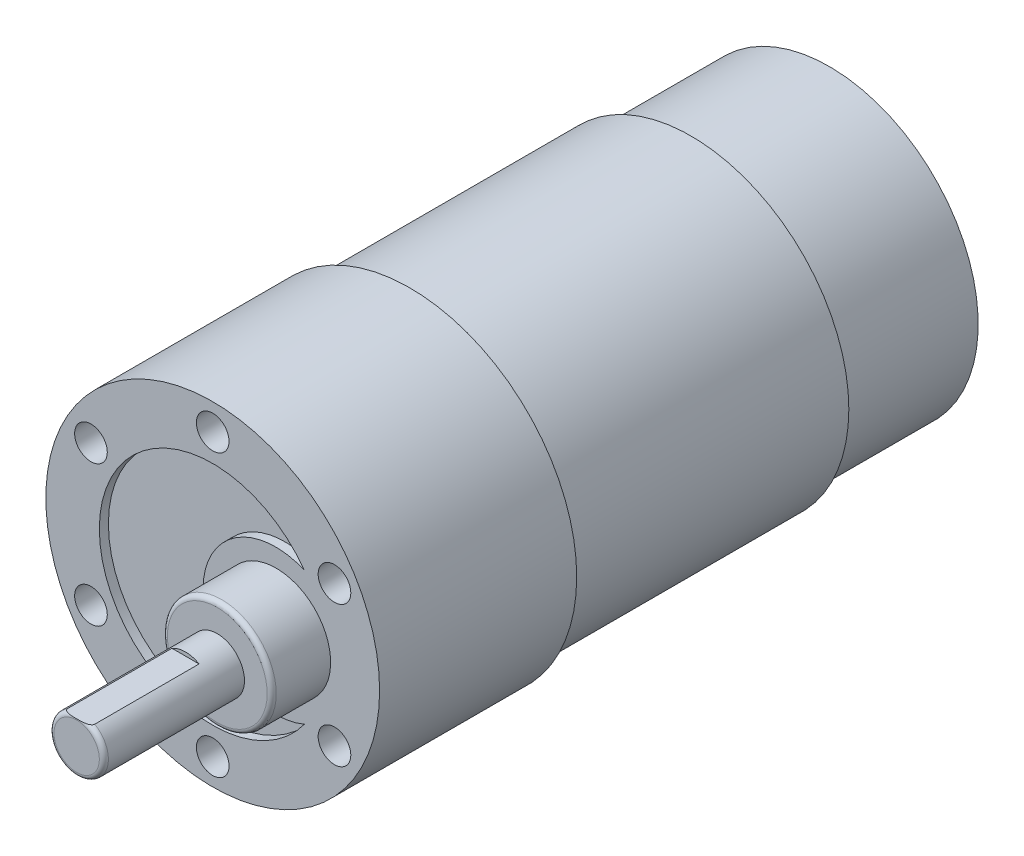
ISO-10303-21;
HEADER;
FILE_DESCRIPTION(('STEP AP214'),'2;1');
FILE_NAME('part.step','',(''),(''),'','','');
FILE_SCHEMA(('AUTOMOTIVE_DESIGN { 1 0 10303 214 1 1 1 1 }'));
ENDSEC;
DATA;
#1=APPLICATION_CONTEXT('core data for automotive mechanical design processes');
#2=APPLICATION_PROTOCOL_DEFINITION('international standard','automotive_design',2000,#1);
#3=PRODUCT_CONTEXT('',#1,'mechanical');
#4=PRODUCT('Part','Part','',(#3));
#5=PRODUCT_RELATED_PRODUCT_CATEGORY('part','',(#4));
#6=PRODUCT_DEFINITION_FORMATION('','',#4);
#7=PRODUCT_DEFINITION_CONTEXT('part definition',#1,'design');
#8=PRODUCT_DEFINITION('design','',#6,#7);
#9=PRODUCT_DEFINITION_SHAPE('','',#8);
#10=(LENGTH_UNIT() NAMED_UNIT(*) SI_UNIT(.MILLI.,.METRE.));
#11=(NAMED_UNIT(*) PLANE_ANGLE_UNIT() SI_UNIT($,.RADIAN.));
#12=(NAMED_UNIT(*) SI_UNIT($,.STERADIAN.) SOLID_ANGLE_UNIT());
#13=UNCERTAINTY_MEASURE_WITH_UNIT(LENGTH_MEASURE(1.E-05),#10,'distance_accuracy_value','');
#14=(GEOMETRIC_REPRESENTATION_CONTEXT(3) GLOBAL_UNCERTAINTY_ASSIGNED_CONTEXT((#13)) GLOBAL_UNIT_ASSIGNED_CONTEXT((#10,
#11,#12)) REPRESENTATION_CONTEXT('',''));
#15=CARTESIAN_POINT('',(0.,0.,0.));
#16=DIRECTION('',(0.,0.,1.));
#17=DIRECTION('',(1.,0.,0.));
#18=AXIS2_PLACEMENT_3D('',#15,#16,#17);
#19=CARTESIAN_POINT('',(0.,0.,-31.));
#20=DIRECTION('',(0.,0.,-1.));
#21=DIRECTION('',(-1.,0.,0.));
#22=AXIS2_PLACEMENT_3D('',#19,#20,#21);
#23=PLANE('',#22);
#24=CARTESIAN_POINT('',(0.,0.,-31.));
#25=DIRECTION('',(0.,0.,-1.));
#26=DIRECTION('',(-1.,0.,0.));
#27=AXIS2_PLACEMENT_3D('',#24,#25,#26);
#28=CIRCLE('',#27,16.4);
#29=CARTESIAN_POINT('',(-16.4,0.,-31.));
#30=VERTEX_POINT('',#29);
#31=EDGE_CURVE('E45',#30,#30,#28,.T.);
#32=ORIENTED_EDGE('',*,*,#31,.F.);
#33=EDGE_LOOP('',(#32));
#34=FACE_BOUND('',#33,.T.);
#35=CARTESIAN_POINT('',(0.,0.,-31.));
#36=DIRECTION('',(0.,0.,-1.));
#37=DIRECTION('',(-1.,0.,0.));
#38=AXIS2_PLACEMENT_3D('',#35,#36,#37);
#39=CIRCLE('',#38,17.4);
#40=CARTESIAN_POINT('',(-17.4,0.,-31.));
#41=VERTEX_POINT('',#40);
#42=EDGE_CURVE('E121',#41,#41,#39,.T.);
#43=ORIENTED_EDGE('',*,*,#42,.T.);
#44=EDGE_LOOP('',(#43));
#45=FACE_BOUND('',#44,.T.);
#46=ADVANCED_FACE('F37',(#34,#45),#23,.T.);
#47=CARTESIAN_POINT('',(0.,0.,21.73));
#48=DIRECTION('',(0.,0.,-1.));
#49=DIRECTION('',(-1.,0.,0.));
#50=AXIS2_PLACEMENT_3D('',#47,#48,#49);
#51=CYLINDRICAL_SURFACE('',#50,18.4);
#52=CARTESIAN_POINT('',(0.,0.,21.73));
#53=DIRECTION('',(0.,0.,1.));
#54=DIRECTION('',(1.,0.,0.));
#55=AXIS2_PLACEMENT_3D('',#52,#53,#54);
#56=CIRCLE('',#55,18.4);
#57=CARTESIAN_POINT('',(18.4,0.,21.73));
#58=VERTEX_POINT('',#57);
#59=EDGE_CURVE('E125',#58,#58,#56,.T.);
#60=ORIENTED_EDGE('',*,*,#59,.F.);
#61=EDGE_LOOP('',(#60));
#62=FACE_BOUND('',#61,.T.);
#63=CARTESIAN_POINT('',(0.,0.,0.));
#64=DIRECTION('',(0.,0.,1.));
#65=DIRECTION('',(1.,0.,0.));
#66=AXIS2_PLACEMENT_3D('',#63,#64,#65);
#67=CIRCLE('',#66,18.4);
#68=CARTESIAN_POINT('',(18.4,0.,0.));
#69=VERTEX_POINT('',#68);
#70=EDGE_CURVE('E124',#69,#69,#67,.T.);
#71=ORIENTED_EDGE('',*,*,#70,.T.);
#72=EDGE_LOOP('',(#71));
#73=FACE_BOUND('',#72,.T.);
#74=ADVANCED_FACE('F178',(#62,#73),#51,.T.);
#75=CARTESIAN_POINT('',(0.,0.,21.73));
#76=DIRECTION('',(0.,0.,1.));
#77=DIRECTION('',(1.,0.,0.));
#78=AXIS2_PLACEMENT_3D('',#75,#76,#77);
#79=PLANE('',#78);
#80=CARTESIAN_POINT('',(13.4233937586587,-7.75000000000016,21.73));
#81=DIRECTION('',(0.,0.,1.));
#82=DIRECTION('',(1.,0.,0.));
#83=AXIS2_PLACEMENT_3D('',#80,#81,#82);
#84=CIRCLE('',#83,1.8);
#85=CARTESIAN_POINT('',(15.2233937586587,-7.75000000000016,21.73));
#86=VERTEX_POINT('',#85);
#87=EDGE_CURVE('E453',#86,#86,#84,.T.);
#88=ORIENTED_EDGE('',*,*,#87,.F.);
#89=EDGE_LOOP('',(#88));
#90=FACE_BOUND('',#89,.T.);
#91=CARTESIAN_POINT('',(13.4233937586589,7.74999999999987,21.73));
#92=DIRECTION('',(0.,0.,1.));
#93=DIRECTION('',(1.,0.,0.));
#94=AXIS2_PLACEMENT_3D('',#91,#92,#93);
#95=CIRCLE('',#94,1.8);
#96=CARTESIAN_POINT('',(15.2233937586589,7.74999999999987,21.73));
#97=VERTEX_POINT('',#96);
#98=EDGE_CURVE('E452',#97,#97,#95,.T.);
#99=ORIENTED_EDGE('',*,*,#98,.F.);
#100=EDGE_LOOP('',(#99));
#101=FACE_BOUND('',#100,.T.);
#102=CARTESIAN_POINT('',(1.08235921504137E-13,15.5,21.73));
#103=DIRECTION('',(0.,0.,1.));
#104=DIRECTION('',(1.,0.,0.));
#105=AXIS2_PLACEMENT_3D('',#102,#103,#104);
#106=CIRCLE('',#105,1.8);
#107=CARTESIAN_POINT('',(1.80000000000011,15.5,21.73));
#108=VERTEX_POINT('',#107);
#109=EDGE_CURVE('E462',#108,#108,#106,.T.);
#110=ORIENTED_EDGE('',*,*,#109,.F.);
#111=EDGE_LOOP('',(#110));
#112=FACE_BOUND('',#111,.T.);
#113=CARTESIAN_POINT('',(-13.4233937586588,7.75000000000006,21.73));
#114=DIRECTION('',(0.,0.,1.));
#115=DIRECTION('',(1.,0.,0.));
#116=AXIS2_PLACEMENT_3D('',#113,#114,#115);
#117=CIRCLE('',#116,1.8);
#118=CARTESIAN_POINT('',(-11.6233937586588,7.75000000000006,21.73));
#119=VERTEX_POINT('',#118);
#120=EDGE_CURVE('E467',#119,#119,#117,.T.);
#121=ORIENTED_EDGE('',*,*,#120,.F.);
#122=EDGE_LOOP('',(#121));
#123=FACE_BOUND('',#122,.T.);
#124=CARTESIAN_POINT('',(-13.4233937586588,-7.74999999999997,21.73));
#125=DIRECTION('',(0.,0.,1.));
#126=DIRECTION('',(1.,0.,0.));
#127=AXIS2_PLACEMENT_3D('',#124,#125,#126);
#128=CIRCLE('',#127,1.8);
#129=CARTESIAN_POINT('',(-11.6233937586588,-7.74999999999997,21.73));
#130=VERTEX_POINT('',#129);
#131=EDGE_CURVE('E473',#130,#130,#128,.T.);
#132=ORIENTED_EDGE('',*,*,#131,.F.);
#133=EDGE_LOOP('',(#132));
#134=FACE_BOUND('',#133,.T.);
#135=CARTESIAN_POINT('',(0.,-15.5,21.73));
#136=DIRECTION('',(0.,0.,1.));
#137=DIRECTION('',(1.,0.,0.));
#138=AXIS2_PLACEMENT_3D('',#135,#136,#137);
#139=CIRCLE('',#138,1.8);
#140=CARTESIAN_POINT('',(1.8,-15.5,21.73));
#141=VERTEX_POINT('',#140);
#142=EDGE_CURVE('E479',#141,#141,#139,.T.);
#143=ORIENTED_EDGE('',*,*,#142,.F.);
#144=EDGE_LOOP('',(#143));
#145=FACE_BOUND('',#144,.T.);
#146=CARTESIAN_POINT('',(6.94021396000303,0.,21.73));
#147=DIRECTION('',(0.,0.,-1.));
#148=DIRECTION('',(1.,0.,0.));
#149=AXIS2_PLACEMENT_3D('',#146,#147,#148);
#150=CIRCLE('',#149,8.);
#151=CARTESIAN_POINT('',(10.116155684814,-7.34257408274541,21.73));
#152=VERTEX_POINT('',#151);
#153=CARTESIAN_POINT('',(10.116155684814,7.3425740827454,21.73));
#154=VERTEX_POINT('',#153);
#155=EDGE_CURVE('E86',#152,#154,#150,.T.);
#156=ORIENTED_EDGE('',*,*,#155,.F.);
#157=CARTESIAN_POINT('',(0.,0.,21.73));
#158=DIRECTION('',(0.,0.,1.));
#159=DIRECTION('',(1.,0.,0.));
#160=AXIS2_PLACEMENT_3D('',#157,#158,#159);
#161=CIRCLE('',#160,12.5);
#162=EDGE_CURVE('E96',#154,#152,#161,.T.);
#163=ORIENTED_EDGE('',*,*,#162,.F.);
#164=EDGE_LOOP('',(#156,#163));
#165=FACE_BOUND('',#164,.T.);
#166=CARTESIAN_POINT('',(7.,0.,21.73));
#167=DIRECTION('',(0.,0.,1.));
#168=DIRECTION('',(1.,0.,0.));
#169=AXIS2_PLACEMENT_3D('',#166,#167,#168);
#170=CIRCLE('',#169,6.);
#171=CARTESIAN_POINT('',(0.999999999999999,0.,21.73));
#172=VERTEX_POINT('',#171);
#173=EDGE_CURVE('E118',#172,#172,#170,.T.);
#174=ORIENTED_EDGE('',*,*,#173,.F.);
#175=EDGE_LOOP('',(#174));
#176=FACE_BOUND('',#175,.T.);
#177=ORIENTED_EDGE('',*,*,#59,.T.);
#178=EDGE_LOOP('',(#177));
#179=FACE_BOUND('',#178,.T.);
#180=ADVANCED_FACE('F184',(#90,#101,#112,#123,#134,#145,#165,#176,#179),#79,.T.);
#181=CARTESIAN_POINT('',(0.,0.,0.));
#182=DIRECTION('',(0.,0.,1.));
#183=DIRECTION('',(1.,0.,0.));
#184=AXIS2_PLACEMENT_3D('',#181,#182,#183);
#185=PLANE('',#184);
#186=CARTESIAN_POINT('',(0.,0.,0.));
#187=DIRECTION('',(0.,0.,1.));
#188=DIRECTION('',(1.,0.,0.));
#189=AXIS2_PLACEMENT_3D('',#186,#187,#188);
#190=CIRCLE('',#189,17.4);
#191=CARTESIAN_POINT('',(17.4,0.,0.));
#192=VERTEX_POINT('',#191);
#193=EDGE_CURVE('E128',#192,#192,#190,.F.);
#194=ORIENTED_EDGE('',*,*,#193,.F.);
#195=EDGE_LOOP('',(#194));
#196=FACE_BOUND('',#195,.T.);
#197=ORIENTED_EDGE('',*,*,#70,.F.);
#198=EDGE_LOOP('',(#197));
#199=FACE_BOUND('',#198,.T.);
#200=ADVANCED_FACE('F182',(#196,#199),#185,.F.);
#201=CARTESIAN_POINT('',(0.,0.,-31.));
#202=DIRECTION('',(0.,0.,1.));
#203=DIRECTION('',(1.,0.,0.));
#204=AXIS2_PLACEMENT_3D('',#201,#202,#203);
#205=CYLINDRICAL_SURFACE('',#204,17.4);
#206=ORIENTED_EDGE('',*,*,#42,.F.);
#207=EDGE_LOOP('',(#206));
#208=FACE_BOUND('',#207,.T.);
#209=ORIENTED_EDGE('',*,*,#193,.T.);
#210=EDGE_LOOP('',(#209));
#211=FACE_BOUND('',#210,.T.);
#212=ADVANCED_FACE('F174',(#208,#211),#205,.T.);
#213=CARTESIAN_POINT('',(7.,0.,28.23));
#214=DIRECTION('',(0.,0.,-1.));
#215=DIRECTION('',(-1.,0.,0.));
#216=AXIS2_PLACEMENT_3D('',#213,#214,#215);
#217=CYLINDRICAL_SURFACE('',#216,6.);
#218=CARTESIAN_POINT('',(7.,0.,27.73));
#219=DIRECTION('',(0.,0.,1.));
#220=DIRECTION('',(1.,0.,0.));
#221=AXIS2_PLACEMENT_3D('',#218,#219,#220);
#222=CIRCLE('',#221,6.);
#223=CARTESIAN_POINT('',(0.999999999999999,0.,27.73));
#224=VERTEX_POINT('',#223);
#225=EDGE_CURVE('E136',#224,#224,#222,.F.);
#226=CARTESIAN_POINT('',(0.999999999999999,0.,27.73));
#227=CARTESIAN_POINT('',(0.999999999999999,0.,27.6675));
#228=CARTESIAN_POINT('',(0.999999999999999,0.,27.605));
#229=CARTESIAN_POINT('',(0.999999999999999,0.,27.48));
#230=CARTESIAN_POINT('',(0.999999999999999,0.,27.4175));
#231=CARTESIAN_POINT('',(0.999999999999999,0.,27.2925));
#232=CARTESIAN_POINT('',(0.999999999999999,0.,27.23));
#233=CARTESIAN_POINT('',(0.999999999999999,0.,27.105));
#234=CARTESIAN_POINT('',(0.999999999999999,0.,27.0425));
#235=CARTESIAN_POINT('',(0.999999999999999,0.,26.9175));
#236=CARTESIAN_POINT('',(0.999999999999999,0.,26.855));
#237=CARTESIAN_POINT('',(0.999999999999999,0.,26.73));
#238=CARTESIAN_POINT('',(0.999999999999999,0.,26.6675));
#239=CARTESIAN_POINT('',(0.999999999999999,0.,26.5425));
#240=CARTESIAN_POINT('',(0.999999999999999,0.,26.48));
#241=CARTESIAN_POINT('',(0.999999999999999,0.,26.355));
#242=CARTESIAN_POINT('',(0.999999999999999,0.,26.2925));
#243=CARTESIAN_POINT('',(0.999999999999999,0.,26.1675));
#244=CARTESIAN_POINT('',(0.999999999999999,0.,26.105));
#245=CARTESIAN_POINT('',(0.999999999999999,0.,25.98));
#246=CARTESIAN_POINT('',(0.999999999999999,0.,25.9175));
#247=CARTESIAN_POINT('',(0.999999999999999,0.,25.7925));
#248=CARTESIAN_POINT('',(0.999999999999999,0.,25.73));
#249=CARTESIAN_POINT('',(0.999999999999999,0.,25.605));
#250=CARTESIAN_POINT('',(0.999999999999999,0.,25.5425));
#251=CARTESIAN_POINT('',(0.999999999999999,0.,25.4175));
#252=CARTESIAN_POINT('',(0.999999999999999,0.,25.355));
#253=CARTESIAN_POINT('',(0.999999999999999,0.,25.23));
#254=CARTESIAN_POINT('',(0.999999999999999,0.,25.1675));
#255=CARTESIAN_POINT('',(0.999999999999999,0.,25.0425));
#256=CARTESIAN_POINT('',(0.999999999999999,0.,24.98));
#257=CARTESIAN_POINT('',(0.999999999999999,0.,24.855));
#258=CARTESIAN_POINT('',(0.999999999999999,0.,24.7925));
#259=CARTESIAN_POINT('',(0.999999999999999,0.,24.6675));
#260=CARTESIAN_POINT('',(0.999999999999999,0.,24.605));
#261=CARTESIAN_POINT('',(0.999999999999999,0.,24.48));
#262=CARTESIAN_POINT('',(0.999999999999999,0.,24.4175));
#263=CARTESIAN_POINT('',(0.999999999999999,0.,24.2925));
#264=CARTESIAN_POINT('',(0.999999999999999,0.,24.23));
#265=CARTESIAN_POINT('',(0.999999999999999,0.,24.105));
#266=CARTESIAN_POINT('',(0.999999999999999,0.,24.0425));
#267=CARTESIAN_POINT('',(0.999999999999999,0.,23.9175));
#268=CARTESIAN_POINT('',(0.999999999999999,0.,23.855));
#269=CARTESIAN_POINT('',(0.999999999999999,0.,23.73));
#270=CARTESIAN_POINT('',(0.999999999999999,0.,23.6675));
#271=CARTESIAN_POINT('',(0.999999999999999,0.,23.5425));
#272=CARTESIAN_POINT('',(0.999999999999999,0.,23.48));
#273=CARTESIAN_POINT('',(0.999999999999999,0.,23.355));
#274=CARTESIAN_POINT('',(0.999999999999999,0.,23.2925));
#275=CARTESIAN_POINT('',(0.999999999999999,0.,23.1675));
#276=CARTESIAN_POINT('',(0.999999999999999,0.,23.105));
#277=CARTESIAN_POINT('',(0.999999999999999,0.,22.98));
#278=CARTESIAN_POINT('',(0.999999999999999,0.,22.9175));
#279=CARTESIAN_POINT('',(0.999999999999999,0.,22.7925));
#280=CARTESIAN_POINT('',(0.999999999999999,0.,22.73));
#281=CARTESIAN_POINT('',(0.999999999999999,0.,22.605));
#282=CARTESIAN_POINT('',(0.999999999999999,0.,22.5425));
#283=CARTESIAN_POINT('',(0.999999999999999,0.,22.4175));
#284=CARTESIAN_POINT('',(0.999999999999999,0.,22.355));
#285=CARTESIAN_POINT('',(0.999999999999999,0.,22.23));
#286=CARTESIAN_POINT('',(0.999999999999999,0.,22.1675));
#287=CARTESIAN_POINT('',(0.999999999999999,0.,22.0425));
#288=CARTESIAN_POINT('',(0.999999999999999,0.,21.98));
#289=CARTESIAN_POINT('',(0.999999999999999,0.,21.855));
#290=CARTESIAN_POINT('',(0.999999999999999,0.,21.7925));
#291=CARTESIAN_POINT('',(0.999999999999999,0.,21.73));
#292=B_SPLINE_CURVE_WITH_KNOTS('',3,(#226,#227,#228,#229,#230,#231,#232,#233,#234,#235,#236,
#237,#238,#239,#240,#241,#242,#243,#244,#245,#246,#247,#248,#249,#250,#251,#252,#253,#254,#255,
#256,#257,#258,#259,#260,#261,#262,#263,#264,#265,#266,#267,#268,#269,#270,#271,#272,#273,#274,
#275,#276,#277,#278,#279,#280,#281,#282,#283,#284,#285,#286,#287,#288,#289,#290,#291),
.UNSPECIFIED.,.F.,.F.,(4,2,2,2,2,2,2,2,2,2,2,2,2,2,2,2,2,2,2,2,2,2,2,2,2,2,2,2,2,2,2,2,4),(0.,
0.187499999999997,0.374999999999997,0.562499999999997,0.749999999999997,0.937499999999997,1.125,
1.3125,1.5,1.6875,1.875,2.0625,2.25,2.4375,2.625,2.8125,3.,3.1875,3.375,3.5625,3.75,3.9375,
4.125,4.3125,4.5,4.6875,4.875,5.0625,5.25,5.4375,5.625,5.8125,6.),.UNSPECIFIED.);
#293=EDGE_CURVE('BSEAM170',#224,#172,#292,.T.);
#294=ORIENTED_EDGE('',*,*,#225,.T.);
#295=ORIENTED_EDGE('',*,*,#173,.T.);
#296=ORIENTED_EDGE('',*,*,#293,.T.);
#297=ORIENTED_EDGE('',*,*,#293,.F.);
#298=EDGE_LOOP('',(#294,#296,#295,#297));
#299=FACE_BOUND('',#298,.T.);
#300=ADVANCED_FACE('F170',(#299),#217,.T.);
#301=CARTESIAN_POINT('',(7.,0.,28.23));
#302=DIRECTION('',(0.,0.,1.));
#303=DIRECTION('',(1.,0.,0.));
#304=AXIS2_PLACEMENT_3D('',#301,#302,#303);
#305=PLANE('',#304);
#306=CARTESIAN_POINT('',(7.,0.,28.23));
#307=DIRECTION('',(0.,0.,1.));
#308=DIRECTION('',(1.,0.,0.));
#309=AXIS2_PLACEMENT_3D('',#306,#307,#308);
#310=CIRCLE('',#309,3.);
#311=CARTESIAN_POINT('',(10.,0.,28.23));
#312=VERTEX_POINT('',#311);
#313=EDGE_CURVE('E114',#312,#312,#310,.T.);
#314=ORIENTED_EDGE('',*,*,#313,.F.);
#315=EDGE_LOOP('',(#314));
#316=FACE_BOUND('',#315,.T.);
#317=CARTESIAN_POINT('',(7.,0.,28.23));
#318=DIRECTION('',(0.,0.,1.));
#319=DIRECTION('',(1.,0.,0.));
#320=AXIS2_PLACEMENT_3D('',#317,#318,#319);
#321=CIRCLE('',#320,5.5);
#322=CARTESIAN_POINT('',(12.5,0.,28.23));
#323=VERTEX_POINT('',#322);
#324=EDGE_CURVE('E133',#323,#323,#321,.T.);
#325=ORIENTED_EDGE('',*,*,#324,.T.);
#326=EDGE_LOOP('',(#325));
#327=FACE_BOUND('',#326,.T.);
#328=ADVANCED_FACE('F167',(#316,#327),#305,.T.);
#329=CARTESIAN_POINT('',(7.,0.,27.73));
#330=DIRECTION('',(0.,0.,1.));
#331=DIRECTION('',(1.,0.,0.));
#332=AXIS2_PLACEMENT_3D('',#329,#330,#331);
#333=TOROIDAL_SURFACE('',#332,5.5,0.5);
#334=ORIENTED_EDGE('',*,*,#225,.F.);
#335=EDGE_LOOP('',(#334));
#336=FACE_BOUND('',#335,.T.);
#337=ORIENTED_EDGE('',*,*,#324,.F.);
#338=EDGE_LOOP('',(#337));
#339=FACE_BOUND('',#338,.T.);
#340=ADVANCED_FACE('F165',(#336,#339),#333,.T.);
#341=CARTESIAN_POINT('',(7.,0.,43.73));
#342=DIRECTION('',(0.,0.,-1.));
#343=DIRECTION('',(-1.,0.,0.));
#344=AXIS2_PLACEMENT_3D('',#341,#342,#343);
#345=CYLINDRICAL_SURFACE('',#344,3.);
#346=DIRECTION('',(0.,0.,1.));
#347=VECTOR('',#346,1.);
#348=CARTESIAN_POINT('',(8.49666295470958,2.6,31.73));
#349=LINE('',#348,#347);
#350=CARTESIAN_POINT('',(8.49666295470958,2.6,31.73));
#351=VERTEX_POINT('',#350);
#352=CARTESIAN_POINT('',(8.49666295470958,2.6,43.2299999999998));
#353=VERTEX_POINT('',#352);
#354=EDGE_CURVE('E112',#351,#353,#349,.T.);
#355=ORIENTED_EDGE('',*,*,#354,.T.);
#356=CARTESIAN_POINT('',(7.,0.,43.23));
#357=DIRECTION('',(0.,0.,1.));
#358=DIRECTION('',(1.,0.,0.));
#359=AXIS2_PLACEMENT_3D('',#356,#357,#358);
#360=CIRCLE('',#359,3.);
#361=CARTESIAN_POINT('',(5.50333704529042,2.6,43.23));
#362=VERTEX_POINT('',#361);
#363=EDGE_CURVE('E140',#353,#362,#360,.F.);
#364=ORIENTED_EDGE('',*,*,#363,.T.);
#365=DIRECTION('',(0.,0.,1.));
#366=VECTOR('',#365,1.);
#367=CARTESIAN_POINT('',(5.50333704529042,2.6,31.73));
#368=LINE('',#367,#366);
#369=CARTESIAN_POINT('',(5.50333704529042,2.6,31.73));
#370=VERTEX_POINT('',#369);
#371=EDGE_CURVE('E111',#370,#362,#368,.T.);
#372=ORIENTED_EDGE('',*,*,#371,.F.);
#373=CARTESIAN_POINT('',(7.,0.,31.73));
#374=DIRECTION('',(0.,0.,1.));
#375=DIRECTION('',(1.,0.,0.));
#376=AXIS2_PLACEMENT_3D('',#373,#374,#375);
#377=CIRCLE('',#376,3.);
#378=EDGE_CURVE('E105',#351,#370,#377,.T.);
#379=ORIENTED_EDGE('',*,*,#378,.F.);
#380=EDGE_LOOP('',(#355,#364,#372,#379));
#381=FACE_BOUND('',#380,.T.);
#382=ORIENTED_EDGE('',*,*,#313,.T.);
#383=EDGE_LOOP('',(#382));
#384=FACE_BOUND('',#383,.T.);
#385=ADVANCED_FACE('F161',(#381,#384),#345,.T.);
#386=CARTESIAN_POINT('',(7.,0.,43.73));
#387=DIRECTION('',(0.,0.,1.));
#388=DIRECTION('',(1.,0.,0.));
#389=AXIS2_PLACEMENT_3D('',#386,#387,#388);
#390=PLANE('',#389);
#391=CARTESIAN_POINT('',(7.,0.,43.73));
#392=DIRECTION('',(0.,0.,1.));
#393=DIRECTION('',(1.,0.,0.));
#394=AXIS2_PLACEMENT_3D('',#391,#392,#393);
#395=CIRCLE('',#394,2.5);
#396=CARTESIAN_POINT('',(5.75278087107535,2.16666666666667,43.73));
#397=VERTEX_POINT('',#396);
#398=EDGE_CURVE('E50',#397,#397,#395,.T.);
#399=ORIENTED_EDGE('',*,*,#398,.T.);
#400=EDGE_LOOP('',(#399));
#401=FACE_BOUND('',#400,.T.);
#402=ADVANCED_FACE('F157',(#401),#390,.T.);
#403=CARTESIAN_POINT('',(5.50333704529042,2.6,31.73));
#404=DIRECTION('',(0.,-1.,0.));
#405=DIRECTION('',(0.,0.,-1.));
#406=AXIS2_PLACEMENT_3D('',#403,#404,#405);
#407=PLANE('',#406);
#408=ORIENTED_EDGE('',*,*,#371,.T.);
#409=CARTESIAN_POINT('',(5.50333704529042,2.6,43.23));
#410=CARTESIAN_POINT('',(5.50330297182275,2.6,43.2449051021484));
#411=CARTESIAN_POINT('',(5.50467083675525,2.6,43.259774095933));
#412=CARTESIAN_POINT('',(5.50991444940275,2.6,43.2889406315826));
#413=CARTESIAN_POINT('',(5.51376915729006,2.6,43.3032419088318));
#414=CARTESIAN_POINT('',(5.52368575958067,2.6,43.3309976942714));
#415=CARTESIAN_POINT('',(5.52974166635572,2.6,43.3444543845247));
#416=CARTESIAN_POINT('',(5.54368448042331,2.6,43.3704029162101));
#417=CARTESIAN_POINT('',(5.55157537457962,2.6,43.3828925766694));
#418=CARTESIAN_POINT('',(5.57429481975214,2.6,43.4144102631289));
#419=CARTESIAN_POINT('',(5.59034743394958,2.6,43.4325553894644));
#420=CARTESIAN_POINT('',(5.62506502382319,2.6,43.46613599544));
#421=CARTESIAN_POINT('',(5.64373697250784,2.6,43.4815639860004));
#422=CARTESIAN_POINT('',(5.696688953828,2.6,43.5201504925236));
#423=CARTESIAN_POINT('',(5.7326295532227,2.6,43.5410092009974));
#424=CARTESIAN_POINT('',(5.80704280455868,2.6,43.577388756016));
#425=CARTESIAN_POINT('',(5.84552031433802,2.6,43.5928989852143));
#426=CARTESIAN_POINT('',(5.94098163922959,2.6,43.6258138881155));
#427=CARTESIAN_POINT('',(5.99869046576304,2.6,43.6410734988371));
#428=CARTESIAN_POINT('',(6.11533814692037,2.6,43.6660190476372));
#429=CARTESIAN_POINT('',(6.17427968032053,2.6,43.6756911693697));
#430=CARTESIAN_POINT('',(6.29303813238887,2.6,43.6912892459589));
#431=CARTESIAN_POINT('',(6.35285827463155,2.6,43.6971894614307));
#432=CARTESIAN_POINT('',(6.47261204277333,2.6,43.7064426430905));
#433=CARTESIAN_POINT('',(6.53254547527937,2.6,43.7097983644472));
#434=CARTESIAN_POINT('',(6.63969636030668,2.6,43.7143271761354));
#435=CARTESIAN_POINT('',(6.68690179857313,2.6,43.7158130032282));
#436=CARTESIAN_POINT('',(6.78133075287034,2.6,43.7180539304078));
#437=CARTESIAN_POINT('',(6.82855426943083,2.6,43.7188090071301));
#438=CARTESIAN_POINT('',(6.9230431065075,2.6,43.7197577844721));
#439=CARTESIAN_POINT('',(6.97030843099862,2.6,43.7199510485086));
#440=CARTESIAN_POINT('',(7.0648383568275,2.6,43.7198205958693));
#441=CARTESIAN_POINT('',(7.11210295816658,2.6,43.719496880295));
#442=CARTESIAN_POINT('',(7.20648900439623,2.6,43.7182580510872));
#443=CARTESIAN_POINT('',(7.25361047011958,2.6,43.7173446407243));
#444=CARTESIAN_POINT('',(7.3478307005282,2.6,43.7147313431131));
#445=CARTESIAN_POINT('',(7.39492946624152,2.6,43.7130314956638));
#446=CARTESIAN_POINT('',(7.48903220553244,2.6,43.7085275098704));
#447=CARTESIAN_POINT('',(7.53603622663395,2.6,43.7057244177043));
#448=CARTESIAN_POINT('',(7.62992254905967,2.6,43.6985656531621));
#449=CARTESIAN_POINT('',(7.67680487433774,2.6,43.6942103140601));
#450=CARTESIAN_POINT('',(7.76359650866925,2.6,43.6841263142836));
#451=CARTESIAN_POINT('',(7.80353833344609,2.6,43.6786855014514));
#452=CARTESIAN_POINT('',(7.88312201062599,2.6,43.6657295010266));
#453=CARTESIAN_POINT('',(7.92276364608335,2.6,43.6582129375471));
#454=CARTESIAN_POINT('',(8.00139823900069,2.6,43.640494115249));
#455=CARTESIAN_POINT('',(8.04039205130276,2.6,43.6302957543494));
#456=CARTESIAN_POINT('',(8.1172706415048,2.6,43.6063996298495));
#457=CARTESIAN_POINT('',(8.1551569510228,2.6,43.5927069813272));
#458=CARTESIAN_POINT('',(8.22944813861561,2.6,43.5605463184295));
#459=CARTESIAN_POINT('',(8.2658290549249,2.6,43.5420216232796));
#460=CARTESIAN_POINT('',(8.33470227153027,2.6,43.4988231560639));
#461=CARTESIAN_POINT('',(8.36722000464244,2.6,43.474193326085));
#462=CARTESIAN_POINT('',(8.40822324657555,2.6,43.4336284868606));
#463=CARTESIAN_POINT('',(8.41978987048696,2.6,43.420816953772));
#464=CARTESIAN_POINT('',(8.44109681949932,2.6,43.393731318176));
#465=CARTESIAN_POINT('',(8.45083729481483,2.6,43.3794573361155));
#466=CARTESIAN_POINT('',(8.46801249183189,2.6,43.3493494890491));
#467=CARTESIAN_POINT('',(8.47542073208243,2.6,43.3335002223719));
#468=CARTESIAN_POINT('',(8.48713863782567,2.6,43.3006994380282));
#469=CARTESIAN_POINT('',(8.49145442932524,2.6,43.283750172498));
#470=CARTESIAN_POINT('',(8.49627778271818,2.6,43.2508985771866));
#471=CARTESIAN_POINT('',(8.49709738041116,2.6,43.2350421628976));
#472=CARTESIAN_POINT('',(8.49575949781529,2.6,43.2033234598881));
#473=CARTESIAN_POINT('',(8.4935770468293,2.6,43.1874622324275));
#474=CARTESIAN_POINT('',(8.48987446930463,2.6,43.1719527308315));
#475=B_SPLINE_CURVE_WITH_KNOTS('',3,(#409,#410,#411,#412,#413,#414,#415,#416,#417,#418,#419,
#420,#421,#422,#423,#424,#425,#426,#427,#428,#429,#430,#431,#432,#433,#434,#435,#436,#437,#438,
#439,#440,#441,#442,#443,#444,#445,#446,#447,#448,#449,#450,#451,#452,#453,#454,#455,#456,#457,
#458,#459,#460,#461,#462,#463,#464,#465,#466,#467,#468,#469,#470,#471,#472,#473,#474),
.UNSPECIFIED.,.F.,.F.,(4,2,2,2,2,2,2,2,2,2,2,2,2,2,2,2,2,2,2,2,2,2,2,2,2,2,2,2,2,2,2,2,4),(0.,
0.0445952721647929,0.0888181097439599,0.132921543203814,0.177121710256438,0.249382432511196,
0.321839307557632,0.445797911195915,0.570001189161511,0.748597910004915,0.927634382412785,
1.1078799085406,1.28792998569448,1.42960976431829,1.57129407275093,1.71308845429779,
1.85488253373345,1.99626887743126,2.13764806682504,2.27889351181036,2.42010864904589,
2.54100078056764,2.66197323714652,2.78277082621243,2.903392591221,3.02549842069349,
3.14674968392238,3.19840665202864,3.25005936909162,3.30227902718044,3.35439495223901,
3.40174717858884,3.44949566606298),.UNSPECIFIED.);
#476=EDGE_CURVE('E57',#362,#353,#475,.T.);
#477=ORIENTED_EDGE('',*,*,#476,.T.);
#478=ORIENTED_EDGE('',*,*,#354,.F.);
#479=DIRECTION('',(1.,0.,0.));
#480=VECTOR('',#479,1.);
#481=CARTESIAN_POINT('',(5.50333704529042,2.6,31.73));
#482=LINE('',#481,#480);
#483=EDGE_CURVE('E108',#370,#351,#482,.T.);
#484=ORIENTED_EDGE('',*,*,#483,.F.);
#485=EDGE_LOOP('',(#408,#477,#478,#484));
#486=FACE_BOUND('',#485,.T.);
#487=ADVANCED_FACE('F151',(#486),#407,.F.);
#488=CARTESIAN_POINT('',(7.,0.,31.73));
#489=DIRECTION('',(0.,0.,1.));
#490=DIRECTION('',(1.,0.,0.));
#491=AXIS2_PLACEMENT_3D('',#488,#489,#490);
#492=PLANE('',#491);
#493=ORIENTED_EDGE('',*,*,#378,.T.);
#494=ORIENTED_EDGE('',*,*,#483,.T.);
#495=EDGE_LOOP('',(#493,#494));
#496=FACE_BOUND('',#495,.T.);
#497=ADVANCED_FACE('F156',(#496),#492,.T.);
#498=CARTESIAN_POINT('',(6.94021396000303,0.,20.73));
#499=DIRECTION('',(0.,0.,1.));
#500=DIRECTION('',(1.,0.,0.));
#501=AXIS2_PLACEMENT_3D('',#498,#499,#500);
#502=CYLINDRICAL_SURFACE('',#501,8.);
#503=ORIENTED_EDGE('',*,*,#155,.T.);
#504=DIRECTION('',(0.,0.,1.));
#505=VECTOR('',#504,1.);
#506=CARTESIAN_POINT('',(10.116155684814,7.3425740827454,20.73));
#507=LINE('',#506,#505);
#508=CARTESIAN_POINT('',(10.116155684814,7.3425740827454,20.73));
#509=VERTEX_POINT('',#508);
#510=EDGE_CURVE('E80',#509,#154,#507,.T.);
#511=ORIENTED_EDGE('',*,*,#510,.F.);
#512=CARTESIAN_POINT('',(6.94021396000303,0.,20.73));
#513=DIRECTION('',(0.,0.,-1.));
#514=DIRECTION('',(1.,0.,0.));
#515=AXIS2_PLACEMENT_3D('',#512,#513,#514);
#516=CIRCLE('',#515,8.);
#517=CARTESIAN_POINT('',(10.116155684814,-7.34257408274541,20.73));
#518=VERTEX_POINT('',#517);
#519=EDGE_CURVE('E83',#518,#509,#516,.T.);
#520=ORIENTED_EDGE('',*,*,#519,.F.);
#521=DIRECTION('',(0.,0.,1.));
#522=VECTOR('',#521,1.);
#523=CARTESIAN_POINT('',(10.116155684814,-7.34257408274541,20.73));
#524=LINE('',#523,#522);
#525=EDGE_CURVE('E91',#518,#152,#524,.T.);
#526=ORIENTED_EDGE('',*,*,#525,.T.);
#527=EDGE_LOOP('',(#503,#511,#520,#526));
#528=FACE_BOUND('',#527,.T.);
#529=ADVANCED_FACE('F82',(#528),#502,.T.);
#530=CARTESIAN_POINT('',(0.,0.,20.73));
#531=DIRECTION('',(0.,0.,1.));
#532=DIRECTION('',(1.,0.,0.));
#533=AXIS2_PLACEMENT_3D('',#530,#531,#532);
#534=CYLINDRICAL_SURFACE('',#533,12.5);
#535=ORIENTED_EDGE('',*,*,#162,.T.);
#536=ORIENTED_EDGE('',*,*,#525,.F.);
#537=CARTESIAN_POINT('',(0.,0.,20.73));
#538=DIRECTION('',(0.,0.,1.));
#539=DIRECTION('',(1.,0.,0.));
#540=AXIS2_PLACEMENT_3D('',#537,#538,#539);
#541=CIRCLE('',#540,12.5);
#542=EDGE_CURVE('E92',#509,#518,#541,.T.);
#543=ORIENTED_EDGE('',*,*,#542,.F.);
#544=ORIENTED_EDGE('',*,*,#510,.T.);
#545=EDGE_LOOP('',(#535,#536,#543,#544));
#546=FACE_BOUND('',#545,.T.);
#547=ADVANCED_FACE('F98',(#546),#534,.F.);
#548=CARTESIAN_POINT('',(3.47010698000152,0.,20.73));
#549=DIRECTION('',(0.,0.,1.));
#550=DIRECTION('',(1.,0.,0.));
#551=AXIS2_PLACEMENT_3D('',#548,#549,#550);
#552=PLANE('',#551);
#553=ORIENTED_EDGE('',*,*,#519,.T.);
#554=ORIENTED_EDGE('',*,*,#542,.T.);
#555=EDGE_LOOP('',(#553,#554));
#556=FACE_BOUND('',#555,.T.);
#557=ADVANCED_FACE('F95',(#556),#552,.T.);
#558=CARTESIAN_POINT('',(7.,0.,43.23));
#559=DIRECTION('',(0.,0.,1.));
#560=DIRECTION('',(1.,0.,0.));
#561=AXIS2_PLACEMENT_3D('',#558,#559,#560);
#562=TOROIDAL_SURFACE('',#561,2.5,0.5);
#563=ORIENTED_EDGE('',*,*,#476,.F.);
#564=ORIENTED_EDGE('',*,*,#363,.F.);
#565=EDGE_LOOP('',(#563,#564));
#566=FACE_BOUND('',#565,.T.);
#567=ORIENTED_EDGE('',*,*,#398,.F.);
#568=EDGE_LOOP('',(#567));
#569=FACE_BOUND('',#568,.T.);
#570=ADVANCED_FACE('F148',(#566,#569),#562,.T.);
#571=CARTESIAN_POINT('',(0.,0.,-46.26));
#572=DIRECTION('',(0.,0.,1.));
#573=DIRECTION('',(1.,0.,0.));
#574=AXIS2_PLACEMENT_3D('',#571,#572,#573);
#575=CYLINDRICAL_SURFACE('',#574,16.4);
#576=CARTESIAN_POINT('',(0.,0.,-46.26));
#577=DIRECTION('',(0.,0.,-1.));
#578=DIRECTION('',(-1.,0.,0.));
#579=AXIS2_PLACEMENT_3D('',#576,#577,#578);
#580=CIRCLE('',#579,16.4);
#581=CARTESIAN_POINT('',(-16.4,0.,-46.26));
#582=VERTEX_POINT('',#581);
#583=EDGE_CURVE('E11',#582,#582,#580,.T.);
#584=ORIENTED_EDGE('',*,*,#583,.F.);
#585=EDGE_LOOP('',(#584));
#586=FACE_BOUND('',#585,.T.);
#587=ORIENTED_EDGE('',*,*,#31,.T.);
#588=EDGE_LOOP('',(#587));
#589=FACE_BOUND('',#588,.T.);
#590=ADVANCED_FACE('F39',(#586,#589),#575,.T.);
#591=CARTESIAN_POINT('',(0.,0.,-46.26));
#592=DIRECTION('',(0.,0.,-1.));
#593=DIRECTION('',(-1.,0.,0.));
#594=AXIS2_PLACEMENT_3D('',#591,#592,#593);
#595=PLANE('',#594);
#596=ORIENTED_EDGE('',*,*,#583,.T.);
#597=EDGE_LOOP('',(#596));
#598=FACE_BOUND('',#597,.T.);
#599=ADVANCED_FACE('F258',(#598),#595,.T.);
#600=CARTESIAN_POINT('',(0.,-15.5,18.73));
#601=DIRECTION('',(0.,0.,1.));
#602=DIRECTION('',(1.,0.,0.));
#603=AXIS2_PLACEMENT_3D('',#600,#601,#602);
#604=CYLINDRICAL_SURFACE('',#603,1.8);
#605=CARTESIAN_POINT('',(0.,-15.5,18.73));
#606=DIRECTION('',(0.,0.,1.));
#607=DIRECTION('',(1.,0.,0.));
#608=AXIS2_PLACEMENT_3D('',#605,#606,#607);
#609=CIRCLE('',#608,1.8);
#610=CARTESIAN_POINT('',(1.8,-15.5,18.73));
#611=VERTEX_POINT('',#610);
#612=EDGE_CURVE('E103',#611,#611,#609,.T.);
#613=ORIENTED_EDGE('',*,*,#612,.F.);
#614=EDGE_LOOP('',(#613));
#615=FACE_BOUND('',#614,.T.);
#616=ORIENTED_EDGE('',*,*,#142,.T.);
#617=EDGE_LOOP('',(#616));
#618=FACE_BOUND('',#617,.T.);
#619=ADVANCED_FACE('F265',(#615,#618),#604,.F.);
#620=CARTESIAN_POINT('',(0.,-15.5,18.73));
#621=DIRECTION('',(0.,0.,1.));
#622=DIRECTION('',(1.,0.,0.));
#623=AXIS2_PLACEMENT_3D('',#620,#621,#622);
#624=PLANE('',#623);
#625=ORIENTED_EDGE('',*,*,#612,.T.);
#626=EDGE_LOOP('',(#625));
#627=FACE_BOUND('',#626,.T.);
#628=ADVANCED_FACE('F273',(#627),#624,.T.);
#629=CARTESIAN_POINT('',(-13.4233937586588,-7.74999999999997,18.73));
#630=DIRECTION('',(0.,0.,1.));
#631=DIRECTION('',(1.,0.,0.));
#632=AXIS2_PLACEMENT_3D('',#629,#630,#631);
#633=CYLINDRICAL_SURFACE('',#632,1.8);
#634=CARTESIAN_POINT('',(-13.4233937586588,-7.74999999999997,18.73));
#635=DIRECTION('',(0.,0.,1.));
#636=DIRECTION('',(1.,0.,0.));
#637=AXIS2_PLACEMENT_3D('',#634,#635,#636);
#638=CIRCLE('',#637,1.8);
#639=CARTESIAN_POINT('',(-11.6233937586588,-7.74999999999997,18.73));
#640=VERTEX_POINT('',#639);
#641=EDGE_CURVE('E476',#640,#640,#638,.T.);
#642=ORIENTED_EDGE('',*,*,#641,.F.);
#643=EDGE_LOOP('',(#642));
#644=FACE_BOUND('',#643,.T.);
#645=ORIENTED_EDGE('',*,*,#131,.T.);
#646=EDGE_LOOP('',(#645));
#647=FACE_BOUND('',#646,.T.);
#648=ADVANCED_FACE('F281',(#644,#647),#633,.F.);
#649=CARTESIAN_POINT('',(-13.4233937586588,-7.74999999999997,18.73));
#650=DIRECTION('',(0.,0.,1.));
#651=DIRECTION('',(1.,0.,0.));
#652=AXIS2_PLACEMENT_3D('',#649,#650,#651);
#653=PLANE('',#652);
#654=ORIENTED_EDGE('',*,*,#641,.T.);
#655=EDGE_LOOP('',(#654));
#656=FACE_BOUND('',#655,.T.);
#657=ADVANCED_FACE('F289',(#656),#653,.T.);
#658=CARTESIAN_POINT('',(-13.4233937586588,7.75000000000006,18.73));
#659=DIRECTION('',(0.,0.,1.));
#660=DIRECTION('',(1.,0.,0.));
#661=AXIS2_PLACEMENT_3D('',#658,#659,#660);
#662=CYLINDRICAL_SURFACE('',#661,1.8);
#663=CARTESIAN_POINT('',(-13.4233937586588,7.75000000000006,18.73));
#664=DIRECTION('',(0.,0.,1.));
#665=DIRECTION('',(1.,0.,0.));
#666=AXIS2_PLACEMENT_3D('',#663,#664,#665);
#667=CIRCLE('',#666,1.8);
#668=CARTESIAN_POINT('',(-11.6233937586588,7.75000000000006,18.73));
#669=VERTEX_POINT('',#668);
#670=EDGE_CURVE('E470',#669,#669,#667,.T.);
#671=ORIENTED_EDGE('',*,*,#670,.F.);
#672=EDGE_LOOP('',(#671));
#673=FACE_BOUND('',#672,.T.);
#674=ORIENTED_EDGE('',*,*,#120,.T.);
#675=EDGE_LOOP('',(#674));
#676=FACE_BOUND('',#675,.T.);
#677=ADVANCED_FACE('F297',(#673,#676),#662,.F.);
#678=CARTESIAN_POINT('',(-13.4233937586588,7.75000000000006,18.73));
#679=DIRECTION('',(0.,0.,1.));
#680=DIRECTION('',(1.,0.,0.));
#681=AXIS2_PLACEMENT_3D('',#678,#679,#680);
#682=PLANE('',#681);
#683=ORIENTED_EDGE('',*,*,#670,.T.);
#684=EDGE_LOOP('',(#683));
#685=FACE_BOUND('',#684,.T.);
#686=ADVANCED_FACE('F305',(#685),#682,.T.);
#687=CARTESIAN_POINT('',(1.08235921504137E-13,15.5,18.73));
#688=DIRECTION('',(0.,0.,1.));
#689=DIRECTION('',(1.,0.,0.));
#690=AXIS2_PLACEMENT_3D('',#687,#688,#689);
#691=CYLINDRICAL_SURFACE('',#690,1.8);
#692=CARTESIAN_POINT('',(1.08235921504137E-13,15.5,18.73));
#693=DIRECTION('',(0.,0.,1.));
#694=DIRECTION('',(1.,0.,0.));
#695=AXIS2_PLACEMENT_3D('',#692,#693,#694);
#696=CIRCLE('',#695,1.8);
#697=CARTESIAN_POINT('',(1.80000000000011,15.5,18.73));
#698=VERTEX_POINT('',#697);
#699=EDGE_CURVE('E464',#698,#698,#696,.T.);
#700=ORIENTED_EDGE('',*,*,#699,.F.);
#701=EDGE_LOOP('',(#700));
#702=FACE_BOUND('',#701,.T.);
#703=ORIENTED_EDGE('',*,*,#109,.T.);
#704=EDGE_LOOP('',(#703));
#705=FACE_BOUND('',#704,.T.);
#706=ADVANCED_FACE('F313',(#702,#705),#691,.F.);
#707=CARTESIAN_POINT('',(1.08235921504137E-13,15.5,18.73));
#708=DIRECTION('',(0.,0.,1.));
#709=DIRECTION('',(1.,0.,0.));
#710=AXIS2_PLACEMENT_3D('',#707,#708,#709);
#711=PLANE('',#710);
#712=ORIENTED_EDGE('',*,*,#699,.T.);
#713=EDGE_LOOP('',(#712));
#714=FACE_BOUND('',#713,.T.);
#715=ADVANCED_FACE('F321',(#714),#711,.T.);
#716=CARTESIAN_POINT('',(13.4233937586589,7.74999999999987,18.73));
#717=DIRECTION('',(0.,0.,1.));
#718=DIRECTION('',(1.,0.,0.));
#719=AXIS2_PLACEMENT_3D('',#716,#717,#718);
#720=CYLINDRICAL_SURFACE('',#719,1.8);
#721=CARTESIAN_POINT('',(13.4233937586589,7.74999999999987,18.73));
#722=DIRECTION('',(0.,0.,1.));
#723=DIRECTION('',(1.,0.,0.));
#724=AXIS2_PLACEMENT_3D('',#721,#722,#723);
#725=CIRCLE('',#724,1.8);
#726=CARTESIAN_POINT('',(15.2233937586589,7.74999999999987,18.73));
#727=VERTEX_POINT('',#726);
#728=EDGE_CURVE('E456',#727,#727,#725,.T.);
#729=ORIENTED_EDGE('',*,*,#728,.F.);
#730=EDGE_LOOP('',(#729));
#731=FACE_BOUND('',#730,.T.);
#732=ORIENTED_EDGE('',*,*,#98,.T.);
#733=EDGE_LOOP('',(#732));
#734=FACE_BOUND('',#733,.T.);
#735=ADVANCED_FACE('F329',(#731,#734),#720,.F.);
#736=CARTESIAN_POINT('',(13.4233937586589,7.74999999999987,18.73));
#737=DIRECTION('',(0.,0.,1.));
#738=DIRECTION('',(1.,0.,0.));
#739=AXIS2_PLACEMENT_3D('',#736,#737,#738);
#740=PLANE('',#739);
#741=ORIENTED_EDGE('',*,*,#728,.T.);
#742=EDGE_LOOP('',(#741));
#743=FACE_BOUND('',#742,.T.);
#744=ADVANCED_FACE('F337',(#743),#740,.T.);
#745=CARTESIAN_POINT('',(13.4233937586587,-7.75000000000016,18.73));
#746=DIRECTION('',(0.,0.,1.));
#747=DIRECTION('',(1.,0.,0.));
#748=AXIS2_PLACEMENT_3D('',#745,#746,#747);
#749=CYLINDRICAL_SURFACE('',#748,1.8);
#750=CARTESIAN_POINT('',(13.4233937586587,-7.75000000000016,18.73));
#751=DIRECTION('',(0.,0.,1.));
#752=DIRECTION('',(1.,0.,0.));
#753=AXIS2_PLACEMENT_3D('',#750,#751,#752);
#754=CIRCLE('',#753,1.8);
#755=CARTESIAN_POINT('',(15.2233937586587,-7.75000000000016,18.73));
#756=VERTEX_POINT('',#755);
#757=EDGE_CURVE('E451',#756,#756,#754,.T.);
#758=ORIENTED_EDGE('',*,*,#757,.F.);
#759=EDGE_LOOP('',(#758));
#760=FACE_BOUND('',#759,.T.);
#761=ORIENTED_EDGE('',*,*,#87,.T.);
#762=EDGE_LOOP('',(#761));
#763=FACE_BOUND('',#762,.T.);
#764=ADVANCED_FACE('F345',(#760,#763),#749,.F.);
#765=CARTESIAN_POINT('',(13.4233937586587,-7.75000000000016,18.73));
#766=DIRECTION('',(0.,0.,1.));
#767=DIRECTION('',(1.,0.,0.));
#768=AXIS2_PLACEMENT_3D('',#765,#766,#767);
#769=PLANE('',#768);
#770=ORIENTED_EDGE('',*,*,#757,.T.);
#771=EDGE_LOOP('',(#770));
#772=FACE_BOUND('',#771,.T.);
#773=ADVANCED_FACE('F353',(#772),#769,.T.);
#774=CLOSED_SHELL('',(#46,#74,#180,#200,#212,#300,#328,#340,#385,#402,#487,#497,#529,#547,#557,
#570,#590,#599,#619,#628,#648,#657,#677,#686,#706,#715,#735,#744,#764,#773));
#775=MANIFOLD_SOLID_BREP('B2',#774);
#776=ADVANCED_BREP_SHAPE_REPRESENTATION('',(#18,#775),#14);
#777=SHAPE_DEFINITION_REPRESENTATION(#9,#776);
ENDSEC;
END-ISO-10303-21;
